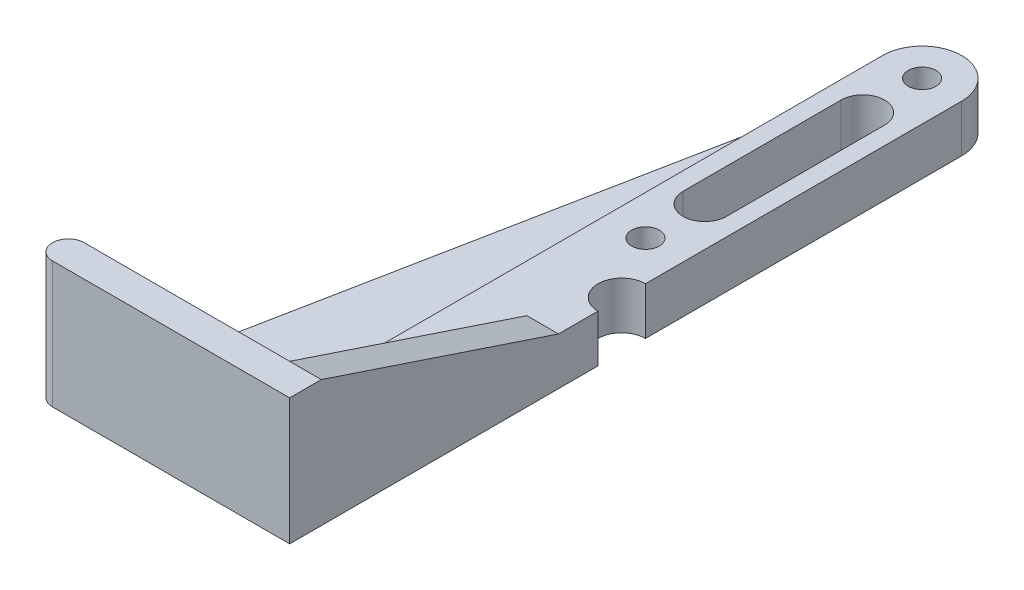
ISO-10303-21;
HEADER;
FILE_DESCRIPTION(('STEP AP214'),'2;1');
FILE_NAME('part.step','',(''),(''),'','','');
FILE_SCHEMA(('AUTOMOTIVE_DESIGN { 1 0 10303 214 1 1 1 1 }'));
ENDSEC;
DATA;
#1=APPLICATION_CONTEXT('core data for automotive mechanical design processes');
#2=APPLICATION_PROTOCOL_DEFINITION('international standard','automotive_design',2000,#1);
#3=PRODUCT_CONTEXT('',#1,'mechanical');
#4=PRODUCT('Part','Part','',(#3));
#5=PRODUCT_RELATED_PRODUCT_CATEGORY('part','',(#4));
#6=PRODUCT_DEFINITION_FORMATION('','',#4);
#7=PRODUCT_DEFINITION_CONTEXT('part definition',#1,'design');
#8=PRODUCT_DEFINITION('design','',#6,#7);
#9=PRODUCT_DEFINITION_SHAPE('','',#8);
#10=(LENGTH_UNIT() NAMED_UNIT(*) SI_UNIT(.MILLI.,.METRE.));
#11=(NAMED_UNIT(*) PLANE_ANGLE_UNIT() SI_UNIT($,.RADIAN.));
#12=(NAMED_UNIT(*) SI_UNIT($,.STERADIAN.) SOLID_ANGLE_UNIT());
#13=UNCERTAINTY_MEASURE_WITH_UNIT(LENGTH_MEASURE(1.E-05),#10,'distance_accuracy_value','');
#14=(GEOMETRIC_REPRESENTATION_CONTEXT(3) GLOBAL_UNCERTAINTY_ASSIGNED_CONTEXT((#13)) GLOBAL_UNIT_ASSIGNED_CONTEXT((#10,
#11,#12)) REPRESENTATION_CONTEXT('',''));
#15=CARTESIAN_POINT('',(0.,0.,0.));
#16=DIRECTION('',(0.,0.,1.));
#17=DIRECTION('',(1.,0.,0.));
#18=AXIS2_PLACEMENT_3D('',#15,#16,#17);
#19=CARTESIAN_POINT('',(5.,6.,0.));
#20=DIRECTION('',(-1.,0.,0.));
#21=DIRECTION('',(0.,0.,1.));
#22=AXIS2_PLACEMENT_3D('',#19,#20,#21);
#23=PLANE('',#22);
#24=DIRECTION('',(0.,0.,-1.));
#25=VECTOR('',#24,1.);
#26=CARTESIAN_POINT('',(5.,0.,0.));
#27=LINE('',#26,#25);
#28=CARTESIAN_POINT('',(5.00000000000001,0.,85.));
#29=VERTEX_POINT('',#28);
#30=CARTESIAN_POINT('',(5.00000000000001,0.,46.));
#31=VERTEX_POINT('',#30);
#32=EDGE_CURVE('E168',#29,#31,#27,.T.);
#33=ORIENTED_EDGE('',*,*,#32,.T.);
#34=DIRECTION('',(0.,1.,0.));
#35=VECTOR('',#34,1.);
#36=CARTESIAN_POINT('',(5.00000000000001,-0.00100000000000013,46.));
#37=LINE('',#36,#35);
#38=CARTESIAN_POINT('',(5.00000000000001,6.,46.));
#39=VERTEX_POINT('',#38);
#40=EDGE_CURVE('E54',#31,#39,#37,.T.);
#41=ORIENTED_EDGE('',*,*,#40,.T.);
#42=DIRECTION('',(0.,0.,-1.));
#43=VECTOR('',#42,1.);
#44=CARTESIAN_POINT('',(5.,6.,0.));
#45=LINE('',#44,#43);
#46=CARTESIAN_POINT('',(5.00000000000001,5.99999999999999,51.));
#47=VERTEX_POINT('',#46);
#48=EDGE_CURVE('E166',#47,#39,#45,.T.);
#49=ORIENTED_EDGE('',*,*,#48,.F.);
#50=DIRECTION('',(0.,0.316227766016838,0.948683298050514));
#51=VECTOR('',#50,1.);
#52=CARTESIAN_POINT('',(5.00000000000001,16.,81.));
#53=LINE('',#52,#51);
#54=CARTESIAN_POINT('',(5.00000000000001,16.,81.));
#55=VERTEX_POINT('',#54);
#56=EDGE_CURVE('E251',#47,#55,#53,.T.);
#57=ORIENTED_EDGE('',*,*,#56,.T.);
#58=DIRECTION('',(0.,0.,-1.));
#59=VECTOR('',#58,1.);
#60=CARTESIAN_POINT('',(5.,16.,81.));
#61=LINE('',#60,#59);
#62=CARTESIAN_POINT('',(5.00000000000001,16.,85.));
#63=VERTEX_POINT('',#62);
#64=EDGE_CURVE('E331',#63,#55,#61,.T.);
#65=ORIENTED_EDGE('',*,*,#64,.F.);
#66=DIRECTION('',(0.,-1.,0.));
#67=VECTOR('',#66,1.);
#68=CARTESIAN_POINT('',(5.00000000000001,6.,85.));
#69=LINE('',#68,#67);
#70=EDGE_CURVE('E183',#63,#29,#69,.T.);
#71=ORIENTED_EDGE('',*,*,#70,.T.);
#72=EDGE_LOOP('',(#33,#41,#49,#57,#65,#71));
#73=FACE_BOUND('',#72,.T.);
#74=ADVANCED_FACE('F38',(#73),#23,.F.);
#75=CARTESIAN_POINT('',(-25.,-32.2490309931942,81.));
#76=DIRECTION('',(0.,0.,-1.));
#77=DIRECTION('',(-1.,0.,0.));
#78=AXIS2_PLACEMENT_3D('',#75,#76,#77);
#79=PLANE('',#78);
#80=DIRECTION('',(-1.,0.,0.));
#81=VECTOR('',#80,1.);
#82=CARTESIAN_POINT('',(-25.,16.,81.));
#83=LINE('',#82,#81);
#84=CARTESIAN_POINT('',(1.00000000000001,16.,81.));
#85=VERTEX_POINT('',#84);
#86=CARTESIAN_POINT('',(-25.,16.,81.));
#87=VERTEX_POINT('',#86);
#88=EDGE_CURVE('E335',#85,#87,#83,.T.);
#89=ORIENTED_EDGE('',*,*,#88,.F.);
#90=DIRECTION('',(0.,-1.,0.));
#91=VECTOR('',#90,1.);
#92=CARTESIAN_POINT('',(1.00000000000001,5.99999999999998,81.));
#93=LINE('',#92,#91);
#94=CARTESIAN_POINT('',(1.00000000000001,5.99999999999998,81.));
#95=VERTEX_POINT('',#94);
#96=EDGE_CURVE('E246',#85,#95,#93,.T.);
#97=ORIENTED_EDGE('',*,*,#96,.T.);
#98=DIRECTION('',(-1.,0.,0.));
#99=VECTOR('',#98,1.);
#100=CARTESIAN_POINT('',(0.,6.,81.));
#101=LINE('',#100,#99);
#102=CARTESIAN_POINT('',(-5.,6.,81.));
#103=VERTEX_POINT('',#102);
#104=EDGE_CURVE('E232',#95,#103,#101,.T.);
#105=ORIENTED_EDGE('',*,*,#104,.T.);
#106=DIRECTION('',(0.,1.,0.));
#107=VECTOR('',#106,1.);
#108=CARTESIAN_POINT('',(-5.,6.,81.));
#109=LINE('',#108,#107);
#110=CARTESIAN_POINT('',(-5.,3.,81.));
#111=VERTEX_POINT('',#110);
#112=EDGE_CURVE('E194',#111,#103,#109,.T.);
#113=ORIENTED_EDGE('',*,*,#112,.F.);
#114=DIRECTION('',(1.,0.,0.));
#115=VECTOR('',#114,1.);
#116=CARTESIAN_POINT('',(-25.,3.,81.));
#117=LINE('',#116,#115);
#118=CARTESIAN_POINT('',(-21.,3.,81.));
#119=VERTEX_POINT('',#118);
#120=EDGE_CURVE('E47',#119,#111,#117,.T.);
#121=ORIENTED_EDGE('',*,*,#120,.F.);
#122=DIRECTION('',(0.,1.,0.));
#123=VECTOR('',#122,1.);
#124=CARTESIAN_POINT('',(-21.,-32.2490309931942,81.));
#125=LINE('',#124,#123);
#126=CARTESIAN_POINT('',(-21.,0.,81.));
#127=VERTEX_POINT('',#126);
#128=EDGE_CURVE('E11',#127,#119,#125,.T.);
#129=ORIENTED_EDGE('',*,*,#128,.F.);
#130=DIRECTION('',(1.,0.,0.));
#131=VECTOR('',#130,1.);
#132=CARTESIAN_POINT('',(-25.,0.,81.));
#133=LINE('',#132,#131);
#134=CARTESIAN_POINT('',(-25.,0.,81.));
#135=VERTEX_POINT('',#134);
#136=EDGE_CURVE('E345',#135,#127,#133,.T.);
#137=ORIENTED_EDGE('',*,*,#136,.F.);
#138=DIRECTION('',(0.,1.,0.));
#139=VECTOR('',#138,1.);
#140=CARTESIAN_POINT('',(-25.,-32.2490309931942,81.));
#141=LINE('',#140,#139);
#142=EDGE_CURVE('E344',#135,#87,#141,.T.);
#143=ORIENTED_EDGE('',*,*,#142,.T.);
#144=EDGE_LOOP('',(#89,#97,#105,#113,#121,#129,#137,#143));
#145=FACE_BOUND('',#144,.T.);
#146=ADVANCED_FACE('F229',(#145),#79,.T.);
#147=CARTESIAN_POINT('',(0.,6.,0.));
#148=DIRECTION('',(0.,-1.,0.));
#149=DIRECTION('',(0.,0.,-1.));
#150=AXIS2_PLACEMENT_3D('',#147,#148,#149);
#151=CYLINDRICAL_SURFACE('',#150,5.);
#152=DIRECTION('',(0.,-1.,0.));
#153=VECTOR('',#152,1.);
#154=CARTESIAN_POINT('',(5.,6.,0.));
#155=LINE('',#154,#153);
#156=CARTESIAN_POINT('',(5.,6.,0.));
#157=VERTEX_POINT('',#156);
#158=CARTESIAN_POINT('',(5.,0.,0.));
#159=VERTEX_POINT('',#158);
#160=EDGE_CURVE('E177',#157,#159,#155,.T.);
#161=ORIENTED_EDGE('',*,*,#160,.T.);
#162=CARTESIAN_POINT('',(0.,0.,0.));
#163=DIRECTION('',(0.,1.,0.));
#164=DIRECTION('',(0.,0.,1.));
#165=AXIS2_PLACEMENT_3D('',#162,#163,#164);
#166=CIRCLE('',#165,5.);
#167=CARTESIAN_POINT('',(-4.90631498140157,0.,-0.963365612462131));
#168=VERTEX_POINT('',#167);
#169=EDGE_CURVE('E189',#159,#168,#166,.T.);
#170=ORIENTED_EDGE('',*,*,#169,.T.);
#171=DIRECTION('',(0.,-1.,0.));
#172=VECTOR('',#171,1.);
#173=CARTESIAN_POINT('',(-4.90631498140157,6.,-0.963365612462131));
#174=LINE('',#173,#172);
#175=CARTESIAN_POINT('',(-4.90631498140156,3.,-0.963365612462131));
#176=VERTEX_POINT('',#175);
#177=EDGE_CURVE('E324',#176,#168,#174,.T.);
#178=ORIENTED_EDGE('',*,*,#177,.F.);
#179=CARTESIAN_POINT('',(0.,3.,0.));
#180=DIRECTION('',(0.,1.,0.));
#181=DIRECTION('',(0.,0.,1.));
#182=AXIS2_PLACEMENT_3D('',#179,#180,#181);
#183=CIRCLE('',#182,5.);
#184=CARTESIAN_POINT('',(-5.,3.,0.));
#185=VERTEX_POINT('',#184);
#186=EDGE_CURVE('E226',#176,#185,#183,.T.);
#187=ORIENTED_EDGE('',*,*,#186,.T.);
#188=DIRECTION('',(0.,-1.,0.));
#189=VECTOR('',#188,1.);
#190=CARTESIAN_POINT('',(-5.,6.,0.));
#191=LINE('',#190,#189);
#192=CARTESIAN_POINT('',(-5.,6.,0.));
#193=VERTEX_POINT('',#192);
#194=EDGE_CURVE('E204',#193,#185,#191,.T.);
#195=ORIENTED_EDGE('',*,*,#194,.F.);
#196=CARTESIAN_POINT('',(0.,6.,0.));
#197=DIRECTION('',(0.,1.,0.));
#198=DIRECTION('',(0.,0.,1.));
#199=AXIS2_PLACEMENT_3D('',#196,#197,#198);
#200=CIRCLE('',#199,5.);
#201=EDGE_CURVE('E200',#157,#193,#200,.T.);
#202=ORIENTED_EDGE('',*,*,#201,.F.);
#203=EDGE_LOOP('',(#161,#170,#178,#187,#195,#202));
#204=FACE_BOUND('',#203,.T.);
#205=ADVANCED_FACE('F40',(#204),#151,.T.);
#206=CARTESIAN_POINT('',(-5.,6.,0.));
#207=DIRECTION('',(1.,0.,0.));
#208=DIRECTION('',(0.,0.,-1.));
#209=AXIS2_PLACEMENT_3D('',#206,#207,#208);
#210=PLANE('',#209);
#211=ORIENTED_EDGE('',*,*,#194,.T.);
#212=DIRECTION('',(0.,0.,1.));
#213=VECTOR('',#212,1.);
#214=CARTESIAN_POINT('',(-5.,3.,0.));
#215=LINE('',#214,#213);
#216=EDGE_CURVE('E213',#185,#111,#215,.T.);
#217=ORIENTED_EDGE('',*,*,#216,.T.);
#218=ORIENTED_EDGE('',*,*,#112,.T.);
#219=DIRECTION('',(0.,0.,1.));
#220=VECTOR('',#219,1.);
#221=CARTESIAN_POINT('',(-5.,6.,0.));
#222=LINE('',#221,#220);
#223=EDGE_CURVE('E185',#193,#103,#222,.T.);
#224=ORIENTED_EDGE('',*,*,#223,.F.);
#225=EDGE_LOOP('',(#211,#217,#218,#224));
#226=FACE_BOUND('',#225,.T.);
#227=ADVANCED_FACE('F222',(#226),#210,.F.);
#228=CARTESIAN_POINT('',(-5.,6.,85.));
#229=DIRECTION('',(0.,0.,-1.));
#230=DIRECTION('',(-1.,0.,0.));
#231=AXIS2_PLACEMENT_3D('',#228,#229,#230);
#232=PLANE('',#231);
#233=DIRECTION('',(1.,0.,0.));
#234=VECTOR('',#233,1.);
#235=CARTESIAN_POINT('',(-5.,0.,85.));
#236=LINE('',#235,#234);
#237=CARTESIAN_POINT('',(-25.,0.,85.));
#238=VERTEX_POINT('',#237);
#239=EDGE_CURVE('E193',#238,#29,#236,.T.);
#240=ORIENTED_EDGE('',*,*,#239,.T.);
#241=ORIENTED_EDGE('',*,*,#70,.F.);
#242=DIRECTION('',(1.,0.,0.));
#243=VECTOR('',#242,1.);
#244=CARTESIAN_POINT('',(5.00000000000001,16.,85.));
#245=LINE('',#244,#243);
#246=CARTESIAN_POINT('',(-25.,16.,85.));
#247=VERTEX_POINT('',#246);
#248=EDGE_CURVE('E327',#247,#63,#245,.T.);
#249=ORIENTED_EDGE('',*,*,#248,.F.);
#250=DIRECTION('',(0.,1.,0.));
#251=VECTOR('',#250,1.);
#252=CARTESIAN_POINT('',(-25.,-32.2490309931942,85.));
#253=LINE('',#252,#251);
#254=EDGE_CURVE('E349',#238,#247,#253,.T.);
#255=ORIENTED_EDGE('',*,*,#254,.F.);
#256=EDGE_LOOP('',(#240,#241,#249,#255));
#257=FACE_BOUND('',#256,.T.);
#258=ADVANCED_FACE('F366',(#257),#232,.F.);
#259=CARTESIAN_POINT('',(5.00000000000001,6.,40.));
#260=VERTEX_POINT('',#259);
#261=EDGE_CURVE('E178',#260,#157,#45,.T.);
#262=ORIENTED_EDGE('',*,*,#261,.F.);
#263=DIRECTION('',(0.,1.,0.));
#264=VECTOR('',#263,1.);
#265=CARTESIAN_POINT('',(5.00000000000001,-0.00100000000000013,40.));
#266=LINE('',#265,#264);
#267=CARTESIAN_POINT('',(5.00000000000001,0.,40.));
#268=VERTEX_POINT('',#267);
#269=EDGE_CURVE('E155',#268,#260,#266,.T.);
#270=ORIENTED_EDGE('',*,*,#269,.F.);
#271=EDGE_CURVE('E198',#268,#159,#27,.T.);
#272=ORIENTED_EDGE('',*,*,#271,.T.);
#273=ORIENTED_EDGE('',*,*,#160,.F.);
#274=EDGE_LOOP('',(#262,#270,#272,#273));
#275=FACE_BOUND('',#274,.T.);
#276=ADVANCED_FACE('F382',(#275),#23,.F.);
#277=CARTESIAN_POINT('',(0.,6.,0.));
#278=DIRECTION('',(0.,1.,0.));
#279=DIRECTION('',(0.,0.,1.));
#280=AXIS2_PLACEMENT_3D('',#277,#278,#279);
#281=PLANE('',#280);
#282=CARTESIAN_POINT('',(5.00000000000001,6.,43.));
#283=DIRECTION('',(0.,1.,0.));
#284=DIRECTION('',(0.,0.,1.));
#285=AXIS2_PLACEMENT_3D('',#282,#283,#284);
#286=CIRCLE('',#285,3.);
#287=EDGE_CURVE('E152',#260,#39,#286,.T.);
#288=ORIENTED_EDGE('',*,*,#287,.F.);
#289=ORIENTED_EDGE('',*,*,#261,.T.);
#290=ORIENTED_EDGE('',*,*,#201,.T.);
#291=ORIENTED_EDGE('',*,*,#223,.T.);
#292=ORIENTED_EDGE('',*,*,#104,.F.);
#293=DIRECTION('',(0.,0.,-1.));
#294=VECTOR('',#293,1.);
#295=CARTESIAN_POINT('',(1.00000000000001,5.99999999999999,51.));
#296=LINE('',#295,#294);
#297=CARTESIAN_POINT('',(1.00000000000001,5.99999999999999,51.));
#298=VERTEX_POINT('',#297);
#299=EDGE_CURVE('E243',#95,#298,#296,.T.);
#300=ORIENTED_EDGE('',*,*,#299,.T.);
#301=DIRECTION('',(1.,0.,0.));
#302=VECTOR('',#301,1.);
#303=CARTESIAN_POINT('',(1.00000000000001,5.99999999999999,51.));
#304=LINE('',#303,#302);
#305=EDGE_CURVE('E175',#298,#47,#304,.T.);
#306=ORIENTED_EDGE('',*,*,#305,.T.);
#307=ORIENTED_EDGE('',*,*,#48,.T.);
#308=EDGE_LOOP('',(#288,#289,#290,#291,#292,#300,#306,#307));
#309=FACE_BOUND('',#308,.T.);
#310=CARTESIAN_POINT('',(0.,6.,0.));
#311=DIRECTION('',(0.,1.,0.));
#312=DIRECTION('',(0.,0.,1.));
#313=AXIS2_PLACEMENT_3D('',#310,#311,#312);
#314=CIRCLE('',#313,1.75);
#315=CARTESIAN_POINT('',(0.,6.,1.75));
#316=VERTEX_POINT('',#315);
#317=EDGE_CURVE('E258',#316,#316,#314,.T.);
#318=ORIENTED_EDGE('',*,*,#317,.F.);
#319=EDGE_LOOP('',(#318));
#320=FACE_BOUND('',#319,.T.);
#321=CARTESIAN_POINT('',(0.,6.,35.));
#322=DIRECTION('',(0.,1.,0.));
#323=DIRECTION('',(0.,0.,1.));
#324=AXIS2_PLACEMENT_3D('',#321,#322,#323);
#325=CIRCLE('',#324,1.75);
#326=CARTESIAN_POINT('',(0.,6.,36.75));
#327=VERTEX_POINT('',#326);
#328=EDGE_CURVE('E259',#327,#327,#325,.T.);
#329=ORIENTED_EDGE('',*,*,#328,.F.);
#330=EDGE_LOOP('',(#329));
#331=FACE_BOUND('',#330,.T.);
#332=CARTESIAN_POINT('',(0.,6.,7.5));
#333=DIRECTION('',(0.,1.,0.));
#334=DIRECTION('',(0.,0.,1.));
#335=AXIS2_PLACEMENT_3D('',#332,#333,#334);
#336=CIRCLE('',#335,2.75);
#337=CARTESIAN_POINT('',(2.75,6.,7.5));
#338=VERTEX_POINT('',#337);
#339=CARTESIAN_POINT('',(-2.75,6.,7.5));
#340=VERTEX_POINT('',#339);
#341=EDGE_CURVE('E285',#338,#340,#336,.T.);
#342=ORIENTED_EDGE('',*,*,#341,.F.);
#343=DIRECTION('',(0.,0.,-1.));
#344=VECTOR('',#343,1.);
#345=CARTESIAN_POINT('',(2.75,6.,7.5));
#346=LINE('',#345,#344);
#347=CARTESIAN_POINT('',(2.75,6.,27.5));
#348=VERTEX_POINT('',#347);
#349=EDGE_CURVE('E296',#348,#338,#346,.T.);
#350=ORIENTED_EDGE('',*,*,#349,.F.);
#351=CARTESIAN_POINT('',(0.,6.,27.5));
#352=DIRECTION('',(0.,1.,0.));
#353=DIRECTION('',(0.,0.,1.));
#354=AXIS2_PLACEMENT_3D('',#351,#352,#353);
#355=CIRCLE('',#354,2.75);
#356=CARTESIAN_POINT('',(-2.75,6.,27.5));
#357=VERTEX_POINT('',#356);
#358=EDGE_CURVE('E292',#357,#348,#355,.T.);
#359=ORIENTED_EDGE('',*,*,#358,.F.);
#360=DIRECTION('',(0.,0.,1.));
#361=VECTOR('',#360,1.);
#362=CARTESIAN_POINT('',(-2.75,6.,7.5));
#363=LINE('',#362,#361);
#364=EDGE_CURVE('E288',#340,#357,#363,.T.);
#365=ORIENTED_EDGE('',*,*,#364,.F.);
#366=EDGE_LOOP('',(#342,#350,#359,#365));
#367=FACE_BOUND('',#366,.T.);
#368=ADVANCED_FACE('F172',(#309,#320,#331,#367),#281,.T.);
#369=CARTESIAN_POINT('',(0.,0.,0.));
#370=DIRECTION('',(0.,1.,0.));
#371=DIRECTION('',(0.,0.,1.));
#372=AXIS2_PLACEMENT_3D('',#369,#370,#371);
#373=PLANE('',#372);
#374=CARTESIAN_POINT('',(0.,0.,0.));
#375=DIRECTION('',(0.,1.,0.));
#376=DIRECTION('',(0.,0.,1.));
#377=AXIS2_PLACEMENT_3D('',#374,#375,#376);
#378=CIRCLE('',#377,1.75);
#379=CARTESIAN_POINT('',(0.,0.,1.75));
#380=VERTEX_POINT('',#379);
#381=EDGE_CURVE('E264',#380,#380,#378,.F.);
#382=ORIENTED_EDGE('',*,*,#381,.F.);
#383=EDGE_LOOP('',(#382));
#384=FACE_BOUND('',#383,.T.);
#385=CARTESIAN_POINT('',(0.,0.,35.));
#386=DIRECTION('',(0.,1.,0.));
#387=DIRECTION('',(0.,0.,1.));
#388=AXIS2_PLACEMENT_3D('',#385,#386,#387);
#389=CIRCLE('',#388,1.75);
#390=CARTESIAN_POINT('',(0.,0.,36.75));
#391=VERTEX_POINT('',#390);
#392=EDGE_CURVE('E263',#391,#391,#389,.F.);
#393=ORIENTED_EDGE('',*,*,#392,.F.);
#394=EDGE_LOOP('',(#393));
#395=FACE_BOUND('',#394,.T.);
#396=DIRECTION('',(0.,0.,1.));
#397=VECTOR('',#396,1.);
#398=CARTESIAN_POINT('',(2.75,0.,7.5));
#399=LINE('',#398,#397);
#400=CARTESIAN_POINT('',(2.75,0.,7.5));
#401=VERTEX_POINT('',#400);
#402=CARTESIAN_POINT('',(2.75,0.,27.5));
#403=VERTEX_POINT('',#402);
#404=EDGE_CURVE('E277',#401,#403,#399,.T.);
#405=ORIENTED_EDGE('',*,*,#404,.F.);
#406=CARTESIAN_POINT('',(0.,0.,7.5));
#407=DIRECTION('',(0.,1.,0.));
#408=DIRECTION('',(0.,0.,1.));
#409=AXIS2_PLACEMENT_3D('',#406,#407,#408);
#410=CIRCLE('',#409,2.75);
#411=CARTESIAN_POINT('',(-2.75,0.,7.5));
#412=VERTEX_POINT('',#411);
#413=EDGE_CURVE('E281',#412,#401,#410,.F.);
#414=ORIENTED_EDGE('',*,*,#413,.F.);
#415=DIRECTION('',(0.,0.,-1.));
#416=VECTOR('',#415,1.);
#417=CARTESIAN_POINT('',(-2.75,0.,7.5));
#418=LINE('',#417,#416);
#419=CARTESIAN_POINT('',(-2.75,0.,27.5));
#420=VERTEX_POINT('',#419);
#421=EDGE_CURVE('E304',#420,#412,#418,.T.);
#422=ORIENTED_EDGE('',*,*,#421,.F.);
#423=CARTESIAN_POINT('',(0.,0.,27.5));
#424=DIRECTION('',(0.,1.,0.));
#425=DIRECTION('',(0.,0.,1.));
#426=AXIS2_PLACEMENT_3D('',#423,#424,#425);
#427=CIRCLE('',#426,2.75);
#428=EDGE_CURVE('E268',#403,#420,#427,.F.);
#429=ORIENTED_EDGE('',*,*,#428,.F.);
#430=EDGE_LOOP('',(#405,#414,#422,#429));
#431=FACE_BOUND('',#430,.T.);
#432=ORIENTED_EDGE('',*,*,#271,.F.);
#433=CARTESIAN_POINT('',(5.00000000000001,0.,43.));
#434=DIRECTION('',(0.,1.,0.));
#435=DIRECTION('',(0.,0.,1.));
#436=AXIS2_PLACEMENT_3D('',#433,#434,#435);
#437=CIRCLE('',#436,3.);
#438=EDGE_CURVE('E160',#31,#268,#437,.F.);
#439=ORIENTED_EDGE('',*,*,#438,.F.);
#440=ORIENTED_EDGE('',*,*,#32,.F.);
#441=ORIENTED_EDGE('',*,*,#239,.F.);
#442=CARTESIAN_POINT('',(-25.,0.,83.));
#443=DIRECTION('',(0.,1.,0.));
#444=DIRECTION('',(0.,0.,1.));
#445=AXIS2_PLACEMENT_3D('',#442,#443,#444);
#446=CIRCLE('',#445,2.);
#447=EDGE_CURVE('E236',#238,#135,#446,.F.);
#448=ORIENTED_EDGE('',*,*,#447,.T.);
#449=ORIENTED_EDGE('',*,*,#136,.T.);
#450=DIRECTION('',(-0.192673122492427,0.,0.981262996280313));
#451=VECTOR('',#450,1.);
#452=CARTESIAN_POINT('',(-5.,0.,-0.486238129047362));
#453=LINE('',#452,#451);
#454=EDGE_CURVE('E317',#168,#127,#453,.T.);
#455=ORIENTED_EDGE('',*,*,#454,.F.);
#456=ORIENTED_EDGE('',*,*,#169,.F.);
#457=EDGE_LOOP('',(#432,#439,#440,#441,#448,#449,#455,#456));
#458=FACE_BOUND('',#457,.T.);
#459=ADVANCED_FACE('F394',(#384,#395,#431,#458),#373,.F.);
#460=CARTESIAN_POINT('',(-25.,-32.2490309931942,83.));
#461=DIRECTION('',(0.,1.,0.));
#462=DIRECTION('',(0.,0.,1.));
#463=AXIS2_PLACEMENT_3D('',#460,#461,#462);
#464=CYLINDRICAL_SURFACE('',#463,2.);
#465=ORIENTED_EDGE('',*,*,#447,.F.);
#466=ORIENTED_EDGE('',*,*,#254,.T.);
#467=CARTESIAN_POINT('',(-25.,16.,83.));
#468=DIRECTION('',(0.,1.,0.));
#469=DIRECTION('',(0.,0.,1.));
#470=AXIS2_PLACEMENT_3D('',#467,#468,#469);
#471=CIRCLE('',#470,2.);
#472=EDGE_CURVE('E340',#87,#247,#471,.T.);
#473=ORIENTED_EDGE('',*,*,#472,.F.);
#474=ORIENTED_EDGE('',*,*,#142,.F.);
#475=EDGE_LOOP('',(#465,#466,#473,#474));
#476=FACE_BOUND('',#475,.T.);
#477=ADVANCED_FACE('F360',(#476),#464,.T.);
#478=CARTESIAN_POINT('',(-25.,16.,83.));
#479=DIRECTION('',(0.,1.,0.));
#480=DIRECTION('',(0.,0.,1.));
#481=AXIS2_PLACEMENT_3D('',#478,#479,#480);
#482=PLANE('',#481);
#483=ORIENTED_EDGE('',*,*,#248,.T.);
#484=ORIENTED_EDGE('',*,*,#64,.T.);
#485=EDGE_CURVE('E336',#55,#85,#83,.T.);
#486=ORIENTED_EDGE('',*,*,#485,.T.);
#487=ORIENTED_EDGE('',*,*,#88,.T.);
#488=ORIENTED_EDGE('',*,*,#472,.T.);
#489=EDGE_LOOP('',(#483,#484,#486,#487,#488));
#490=FACE_BOUND('',#489,.T.);
#491=ADVANCED_FACE('F364',(#490),#482,.T.);
#492=CARTESIAN_POINT('',(-11.,3.,40.));
#493=DIRECTION('',(0.,1.,0.));
#494=DIRECTION('',(0.,0.,1.));
#495=AXIS2_PLACEMENT_3D('',#492,#493,#494);
#496=PLANE('',#495);
#497=ORIENTED_EDGE('',*,*,#186,.F.);
#498=DIRECTION('',(-0.192673122492427,0.,0.981262996280313));
#499=VECTOR('',#498,1.);
#500=CARTESIAN_POINT('',(-5.,3.,-0.486238129047362));
#501=LINE('',#500,#499);
#502=EDGE_CURVE('E216',#176,#119,#501,.T.);
#503=ORIENTED_EDGE('',*,*,#502,.T.);
#504=ORIENTED_EDGE('',*,*,#120,.T.);
#505=ORIENTED_EDGE('',*,*,#216,.F.);
#506=EDGE_LOOP('',(#497,#503,#504,#505));
#507=FACE_BOUND('',#506,.T.);
#508=ADVANCED_FACE('F212',(#507),#496,.T.);
#509=CARTESIAN_POINT('',(-5.,0.,-0.486238129047362));
#510=DIRECTION('',(-0.981262996280313,0.,-0.192673122492427));
#511=DIRECTION('',(-0.192673122492427,0.,0.981262996280313));
#512=AXIS2_PLACEMENT_3D('',#509,#510,#511);
#513=PLANE('',#512);
#514=ORIENTED_EDGE('',*,*,#502,.F.);
#515=ORIENTED_EDGE('',*,*,#177,.T.);
#516=ORIENTED_EDGE('',*,*,#454,.T.);
#517=ORIENTED_EDGE('',*,*,#128,.T.);
#518=EDGE_LOOP('',(#514,#515,#516,#517));
#519=FACE_BOUND('',#518,.T.);
#520=ADVANCED_FACE('F403',(#519),#513,.T.);
#521=CARTESIAN_POINT('',(0.,-0.00100000000000013,7.5));
#522=DIRECTION('',(0.,1.,0.));
#523=DIRECTION('',(0.,0.,1.));
#524=AXIS2_PLACEMENT_3D('',#521,#522,#523);
#525=CYLINDRICAL_SURFACE('',#524,2.75);
#526=ORIENTED_EDGE('',*,*,#413,.T.);
#527=DIRECTION('',(0.,1.,0.));
#528=VECTOR('',#527,1.);
#529=CARTESIAN_POINT('',(2.75,-0.00100000000000013,7.5));
#530=LINE('',#529,#528);
#531=EDGE_CURVE('E301',#401,#338,#530,.T.);
#532=ORIENTED_EDGE('',*,*,#531,.T.);
#533=ORIENTED_EDGE('',*,*,#341,.T.);
#534=DIRECTION('',(0.,1.,0.));
#535=VECTOR('',#534,1.);
#536=CARTESIAN_POINT('',(-2.75,-0.00100000000000013,7.5));
#537=LINE('',#536,#535);
#538=EDGE_CURVE('E300',#412,#340,#537,.T.);
#539=ORIENTED_EDGE('',*,*,#538,.F.);
#540=EDGE_LOOP('',(#526,#532,#533,#539));
#541=FACE_BOUND('',#540,.T.);
#542=ADVANCED_FACE('F425',(#541),#525,.F.);
#543=CARTESIAN_POINT('',(2.75,-0.00100000000000013,7.5));
#544=DIRECTION('',(1.,0.,0.));
#545=DIRECTION('',(0.,0.,-1.));
#546=AXIS2_PLACEMENT_3D('',#543,#544,#545);
#547=PLANE('',#546);
#548=ORIENTED_EDGE('',*,*,#404,.T.);
#549=DIRECTION('',(0.,1.,0.));
#550=VECTOR('',#549,1.);
#551=CARTESIAN_POINT('',(2.75,-0.00100000000000013,27.5));
#552=LINE('',#551,#550);
#553=EDGE_CURVE('E305',#403,#348,#552,.T.);
#554=ORIENTED_EDGE('',*,*,#553,.T.);
#555=ORIENTED_EDGE('',*,*,#349,.T.);
#556=ORIENTED_EDGE('',*,*,#531,.F.);
#557=EDGE_LOOP('',(#548,#554,#555,#556));
#558=FACE_BOUND('',#557,.T.);
#559=ADVANCED_FACE('F430',(#558),#547,.F.);
#560=CARTESIAN_POINT('',(0.,-0.00100000000000013,27.5));
#561=DIRECTION('',(0.,1.,0.));
#562=DIRECTION('',(0.,0.,1.));
#563=AXIS2_PLACEMENT_3D('',#560,#561,#562);
#564=CYLINDRICAL_SURFACE('',#563,2.75);
#565=ORIENTED_EDGE('',*,*,#428,.T.);
#566=DIRECTION('',(0.,1.,0.));
#567=VECTOR('',#566,1.);
#568=CARTESIAN_POINT('',(-2.75,-0.00100000000000013,27.5));
#569=LINE('',#568,#567);
#570=EDGE_CURVE('E308',#420,#357,#569,.T.);
#571=ORIENTED_EDGE('',*,*,#570,.T.);
#572=ORIENTED_EDGE('',*,*,#358,.T.);
#573=ORIENTED_EDGE('',*,*,#553,.F.);
#574=EDGE_LOOP('',(#565,#571,#572,#573));
#575=FACE_BOUND('',#574,.T.);
#576=ADVANCED_FACE('F436',(#575),#564,.F.);
#577=CARTESIAN_POINT('',(-2.75,-0.00100000000000013,7.5));
#578=DIRECTION('',(-1.,0.,0.));
#579=DIRECTION('',(0.,0.,1.));
#580=AXIS2_PLACEMENT_3D('',#577,#578,#579);
#581=PLANE('',#580);
#582=ORIENTED_EDGE('',*,*,#421,.T.);
#583=ORIENTED_EDGE('',*,*,#538,.T.);
#584=ORIENTED_EDGE('',*,*,#364,.T.);
#585=ORIENTED_EDGE('',*,*,#570,.F.);
#586=EDGE_LOOP('',(#582,#583,#584,#585));
#587=FACE_BOUND('',#586,.T.);
#588=ADVANCED_FACE('F432',(#587),#581,.F.);
#589=CARTESIAN_POINT('',(0.,-0.00100000000000013,35.));
#590=DIRECTION('',(0.,1.,0.));
#591=DIRECTION('',(0.,0.,1.));
#592=AXIS2_PLACEMENT_3D('',#589,#590,#591);
#593=CYLINDRICAL_SURFACE('',#592,1.75);
#594=CARTESIAN_POINT('',(0.,6.,36.75));
#595=CARTESIAN_POINT('',(0.,5.9375,36.75));
#596=CARTESIAN_POINT('',(0.,5.875,36.75));
#597=CARTESIAN_POINT('',(0.,5.75,36.75));
#598=CARTESIAN_POINT('',(0.,5.6875,36.75));
#599=CARTESIAN_POINT('',(0.,5.5625,36.75));
#600=CARTESIAN_POINT('',(0.,5.5,36.75));
#601=CARTESIAN_POINT('',(0.,5.375,36.75));
#602=CARTESIAN_POINT('',(0.,5.3125,36.75));
#603=CARTESIAN_POINT('',(0.,5.1875,36.75));
#604=CARTESIAN_POINT('',(0.,5.125,36.75));
#605=CARTESIAN_POINT('',(0.,5.,36.75));
#606=CARTESIAN_POINT('',(0.,4.9375,36.75));
#607=CARTESIAN_POINT('',(0.,4.8125,36.75));
#608=CARTESIAN_POINT('',(0.,4.75,36.75));
#609=CARTESIAN_POINT('',(0.,4.625,36.75));
#610=CARTESIAN_POINT('',(0.,4.5625,36.75));
#611=CARTESIAN_POINT('',(0.,4.4375,36.75));
#612=CARTESIAN_POINT('',(0.,4.375,36.75));
#613=CARTESIAN_POINT('',(0.,4.25,36.75));
#614=CARTESIAN_POINT('',(0.,4.1875,36.75));
#615=CARTESIAN_POINT('',(0.,4.0625,36.75));
#616=CARTESIAN_POINT('',(0.,4.,36.75));
#617=CARTESIAN_POINT('',(0.,3.875,36.75));
#618=CARTESIAN_POINT('',(0.,3.8125,36.75));
#619=CARTESIAN_POINT('',(0.,3.6875,36.75));
#620=CARTESIAN_POINT('',(0.,3.625,36.75));
#621=CARTESIAN_POINT('',(0.,3.5,36.75));
#622=CARTESIAN_POINT('',(0.,3.4375,36.75));
#623=CARTESIAN_POINT('',(0.,3.3125,36.75));
#624=CARTESIAN_POINT('',(0.,3.25,36.75));
#625=CARTESIAN_POINT('',(0.,3.125,36.75));
#626=CARTESIAN_POINT('',(0.,3.0625,36.75));
#627=CARTESIAN_POINT('',(0.,2.9375,36.75));
#628=CARTESIAN_POINT('',(0.,2.875,36.75));
#629=CARTESIAN_POINT('',(0.,2.75,36.75));
#630=CARTESIAN_POINT('',(0.,2.6875,36.75));
#631=CARTESIAN_POINT('',(0.,2.5625,36.75));
#632=CARTESIAN_POINT('',(0.,2.5,36.75));
#633=CARTESIAN_POINT('',(0.,2.375,36.75));
#634=CARTESIAN_POINT('',(0.,2.3125,36.75));
#635=CARTESIAN_POINT('',(0.,2.1875,36.75));
#636=CARTESIAN_POINT('',(0.,2.125,36.75));
#637=CARTESIAN_POINT('',(0.,2.,36.75));
#638=CARTESIAN_POINT('',(0.,1.9375,36.75));
#639=CARTESIAN_POINT('',(0.,1.8125,36.75));
#640=CARTESIAN_POINT('',(0.,1.75,36.75));
#641=CARTESIAN_POINT('',(0.,1.625,36.75));
#642=CARTESIAN_POINT('',(0.,1.5625,36.75));
#643=CARTESIAN_POINT('',(0.,1.4375,36.75));
#644=CARTESIAN_POINT('',(0.,1.375,36.75));
#645=CARTESIAN_POINT('',(0.,1.25,36.75));
#646=CARTESIAN_POINT('',(0.,1.1875,36.75));
#647=CARTESIAN_POINT('',(0.,1.0625,36.75));
#648=CARTESIAN_POINT('',(0.,1.,36.75));
#649=CARTESIAN_POINT('',(0.,0.875,36.75));
#650=CARTESIAN_POINT('',(0.,0.8125,36.75));
#651=CARTESIAN_POINT('',(0.,0.6875,36.75));
#652=CARTESIAN_POINT('',(0.,0.625,36.75));
#653=CARTESIAN_POINT('',(0.,0.5,36.75));
#654=CARTESIAN_POINT('',(0.,0.4375,36.75));
#655=CARTESIAN_POINT('',(0.,0.3125,36.75));
#656=CARTESIAN_POINT('',(0.,0.25,36.75));
#657=CARTESIAN_POINT('',(0.,0.125,36.75));
#658=CARTESIAN_POINT('',(0.,0.0625000000000001,36.75));
#659=CARTESIAN_POINT('',(0.,0.,36.75));
#660=B_SPLINE_CURVE_WITH_KNOTS('',3,(#594,#595,#596,#597,#598,#599,#600,#601,#602,#603,#604,
#605,#606,#607,#608,#609,#610,#611,#612,#613,#614,#615,#616,#617,#618,#619,#620,#621,#622,#623,
#624,#625,#626,#627,#628,#629,#630,#631,#632,#633,#634,#635,#636,#637,#638,#639,#640,#641,#642,
#643,#644,#645,#646,#647,#648,#649,#650,#651,#652,#653,#654,#655,#656,#657,#658,#659),
.UNSPECIFIED.,.F.,.F.,(4,2,2,2,2,2,2,2,2,2,2,2,2,2,2,2,2,2,2,2,2,2,2,2,2,2,2,2,2,2,2,2,4),(0.,
0.1875,0.375,0.5625,0.75,0.9375,1.125,1.3125,1.5,1.6875,1.875,2.0625,2.25,2.4375,2.625,2.8125,
3.,3.1875,3.375,3.5625,3.75,3.9375,4.125,4.3125,4.5,4.6875,4.875,5.0625,5.25,5.4375,5.625,
5.8125,6.),.UNSPECIFIED.);
#661=EDGE_CURVE('BSEAM435',#327,#391,#660,.T.);
#662=ORIENTED_EDGE('',*,*,#328,.T.);
#663=ORIENTED_EDGE('',*,*,#392,.T.);
#664=ORIENTED_EDGE('',*,*,#661,.T.);
#665=ORIENTED_EDGE('',*,*,#661,.F.);
#666=EDGE_LOOP('',(#662,#664,#663,#665));
#667=FACE_BOUND('',#666,.T.);
#668=ADVANCED_FACE('F435',(#667),#593,.F.);
#669=CARTESIAN_POINT('',(0.,-0.00100000000000013,0.));
#670=DIRECTION('',(0.,1.,0.));
#671=DIRECTION('',(0.,0.,1.));
#672=AXIS2_PLACEMENT_3D('',#669,#670,#671);
#673=CYLINDRICAL_SURFACE('',#672,1.75);
#674=CARTESIAN_POINT('',(0.,6.,1.75));
#675=CARTESIAN_POINT('',(0.,5.9375,1.75));
#676=CARTESIAN_POINT('',(0.,5.875,1.75));
#677=CARTESIAN_POINT('',(0.,5.75,1.75));
#678=CARTESIAN_POINT('',(0.,5.6875,1.75));
#679=CARTESIAN_POINT('',(0.,5.5625,1.75));
#680=CARTESIAN_POINT('',(0.,5.5,1.75));
#681=CARTESIAN_POINT('',(0.,5.375,1.75));
#682=CARTESIAN_POINT('',(0.,5.3125,1.75));
#683=CARTESIAN_POINT('',(0.,5.1875,1.75));
#684=CARTESIAN_POINT('',(0.,5.125,1.75));
#685=CARTESIAN_POINT('',(0.,5.,1.75));
#686=CARTESIAN_POINT('',(0.,4.9375,1.75));
#687=CARTESIAN_POINT('',(0.,4.8125,1.75));
#688=CARTESIAN_POINT('',(0.,4.75,1.75));
#689=CARTESIAN_POINT('',(0.,4.625,1.75));
#690=CARTESIAN_POINT('',(0.,4.5625,1.75));
#691=CARTESIAN_POINT('',(0.,4.4375,1.75));
#692=CARTESIAN_POINT('',(0.,4.375,1.75));
#693=CARTESIAN_POINT('',(0.,4.25,1.75));
#694=CARTESIAN_POINT('',(0.,4.1875,1.75));
#695=CARTESIAN_POINT('',(0.,4.0625,1.75));
#696=CARTESIAN_POINT('',(0.,4.,1.75));
#697=CARTESIAN_POINT('',(0.,3.875,1.75));
#698=CARTESIAN_POINT('',(0.,3.8125,1.75));
#699=CARTESIAN_POINT('',(0.,3.6875,1.75));
#700=CARTESIAN_POINT('',(0.,3.625,1.75));
#701=CARTESIAN_POINT('',(0.,3.5,1.75));
#702=CARTESIAN_POINT('',(0.,3.4375,1.75));
#703=CARTESIAN_POINT('',(0.,3.3125,1.75));
#704=CARTESIAN_POINT('',(0.,3.25,1.75));
#705=CARTESIAN_POINT('',(0.,3.125,1.75));
#706=CARTESIAN_POINT('',(0.,3.0625,1.75));
#707=CARTESIAN_POINT('',(0.,2.9375,1.75));
#708=CARTESIAN_POINT('',(0.,2.875,1.75));
#709=CARTESIAN_POINT('',(0.,2.75,1.75));
#710=CARTESIAN_POINT('',(0.,2.6875,1.75));
#711=CARTESIAN_POINT('',(0.,2.5625,1.75));
#712=CARTESIAN_POINT('',(0.,2.5,1.75));
#713=CARTESIAN_POINT('',(0.,2.375,1.75));
#714=CARTESIAN_POINT('',(0.,2.3125,1.75));
#715=CARTESIAN_POINT('',(0.,2.1875,1.75));
#716=CARTESIAN_POINT('',(0.,2.125,1.75));
#717=CARTESIAN_POINT('',(0.,2.,1.75));
#718=CARTESIAN_POINT('',(0.,1.9375,1.75));
#719=CARTESIAN_POINT('',(0.,1.8125,1.75));
#720=CARTESIAN_POINT('',(0.,1.75,1.75));
#721=CARTESIAN_POINT('',(0.,1.625,1.75));
#722=CARTESIAN_POINT('',(0.,1.5625,1.75));
#723=CARTESIAN_POINT('',(0.,1.4375,1.75));
#724=CARTESIAN_POINT('',(0.,1.375,1.75));
#725=CARTESIAN_POINT('',(0.,1.25,1.75));
#726=CARTESIAN_POINT('',(0.,1.1875,1.75));
#727=CARTESIAN_POINT('',(0.,1.0625,1.75));
#728=CARTESIAN_POINT('',(0.,1.,1.75));
#729=CARTESIAN_POINT('',(0.,0.875,1.75));
#730=CARTESIAN_POINT('',(0.,0.8125,1.75));
#731=CARTESIAN_POINT('',(0.,0.6875,1.75));
#732=CARTESIAN_POINT('',(0.,0.625,1.75));
#733=CARTESIAN_POINT('',(0.,0.5,1.75));
#734=CARTESIAN_POINT('',(0.,0.4375,1.75));
#735=CARTESIAN_POINT('',(0.,0.3125,1.75));
#736=CARTESIAN_POINT('',(0.,0.25,1.75));
#737=CARTESIAN_POINT('',(0.,0.125,1.75));
#738=CARTESIAN_POINT('',(0.,0.0625000000000001,1.75));
#739=CARTESIAN_POINT('',(0.,0.,1.75));
#740=B_SPLINE_CURVE_WITH_KNOTS('',3,(#674,#675,#676,#677,#678,#679,#680,#681,#682,#683,#684,
#685,#686,#687,#688,#689,#690,#691,#692,#693,#694,#695,#696,#697,#698,#699,#700,#701,#702,#703,
#704,#705,#706,#707,#708,#709,#710,#711,#712,#713,#714,#715,#716,#717,#718,#719,#720,#721,#722,
#723,#724,#725,#726,#727,#728,#729,#730,#731,#732,#733,#734,#735,#736,#737,#738,#739),
.UNSPECIFIED.,.F.,.F.,(4,2,2,2,2,2,2,2,2,2,2,2,2,2,2,2,2,2,2,2,2,2,2,2,2,2,2,2,2,2,2,2,4),(0.,
0.1875,0.375,0.5625,0.75,0.9375,1.125,1.3125,1.5,1.6875,1.875,2.0625,2.25,2.4375,2.625,2.8125,
3.,3.1875,3.375,3.5625,3.75,3.9375,4.125,4.3125,4.5,4.6875,4.875,5.0625,5.25,5.4375,5.625,
5.8125,6.),.UNSPECIFIED.);
#741=EDGE_CURVE('BSEAM378',#316,#380,#740,.T.);
#742=ORIENTED_EDGE('',*,*,#317,.T.);
#743=ORIENTED_EDGE('',*,*,#381,.T.);
#744=ORIENTED_EDGE('',*,*,#741,.T.);
#745=ORIENTED_EDGE('',*,*,#741,.F.);
#746=EDGE_LOOP('',(#742,#744,#743,#745));
#747=FACE_BOUND('',#746,.T.);
#748=ADVANCED_FACE('F378',(#747),#673,.F.);
#749=CARTESIAN_POINT('',(1.00000000000001,16.,81.));
#750=DIRECTION('',(0.,0.948683298050514,-0.316227766016838));
#751=DIRECTION('',(0.,0.316227766016838,0.948683298050514));
#752=AXIS2_PLACEMENT_3D('',#749,#750,#751);
#753=PLANE('',#752);
#754=ORIENTED_EDGE('',*,*,#56,.F.);
#755=ORIENTED_EDGE('',*,*,#305,.F.);
#756=DIRECTION('',(0.,0.316227766016838,0.948683298050514));
#757=VECTOR('',#756,1.);
#758=CARTESIAN_POINT('',(1.00000000000001,16.,81.));
#759=LINE('',#758,#757);
#760=EDGE_CURVE('E62',#298,#85,#759,.T.);
#761=ORIENTED_EDGE('',*,*,#760,.T.);
#762=ORIENTED_EDGE('',*,*,#485,.F.);
#763=EDGE_LOOP('',(#754,#755,#761,#762));
#764=FACE_BOUND('',#763,.T.);
#765=ADVANCED_FACE('F368',(#764),#753,.T.);
#766=CARTESIAN_POINT('',(1.,0.,0.));
#767=DIRECTION('',(1.,0.,0.));
#768=DIRECTION('',(0.,0.,-1.));
#769=AXIS2_PLACEMENT_3D('',#766,#767,#768);
#770=PLANE('',#769);
#771=ORIENTED_EDGE('',*,*,#96,.F.);
#772=ORIENTED_EDGE('',*,*,#760,.F.);
#773=ORIENTED_EDGE('',*,*,#299,.F.);
#774=EDGE_LOOP('',(#771,#772,#773));
#775=FACE_BOUND('',#774,.T.);
#776=ADVANCED_FACE('F369',(#775),#770,.F.);
#777=CARTESIAN_POINT('',(5.00000000000001,-0.00100000000000013,43.));
#778=DIRECTION('',(0.,1.,0.));
#779=DIRECTION('',(0.,0.,1.));
#780=AXIS2_PLACEMENT_3D('',#777,#778,#779);
#781=CYLINDRICAL_SURFACE('',#780,3.);
#782=ORIENTED_EDGE('',*,*,#438,.T.);
#783=ORIENTED_EDGE('',*,*,#269,.T.);
#784=ORIENTED_EDGE('',*,*,#287,.T.);
#785=ORIENTED_EDGE('',*,*,#40,.F.);
#786=EDGE_LOOP('',(#782,#783,#784,#785));
#787=FACE_BOUND('',#786,.T.);
#788=ADVANCED_FACE('F153',(#787),#781,.F.);
#789=CLOSED_SHELL('',(#74,#146,#205,#227,#258,#276,#368,#459,#477,#491,#508,#520,#542,#559,#576,
#588,#668,#748,#765,#776,#788));
#790=MANIFOLD_SOLID_BREP('B2',#789);
#791=ADVANCED_BREP_SHAPE_REPRESENTATION('',(#18,#790),#14);
#792=SHAPE_DEFINITION_REPRESENTATION(#9,#791);
ENDSEC;
END-ISO-10303-21;
